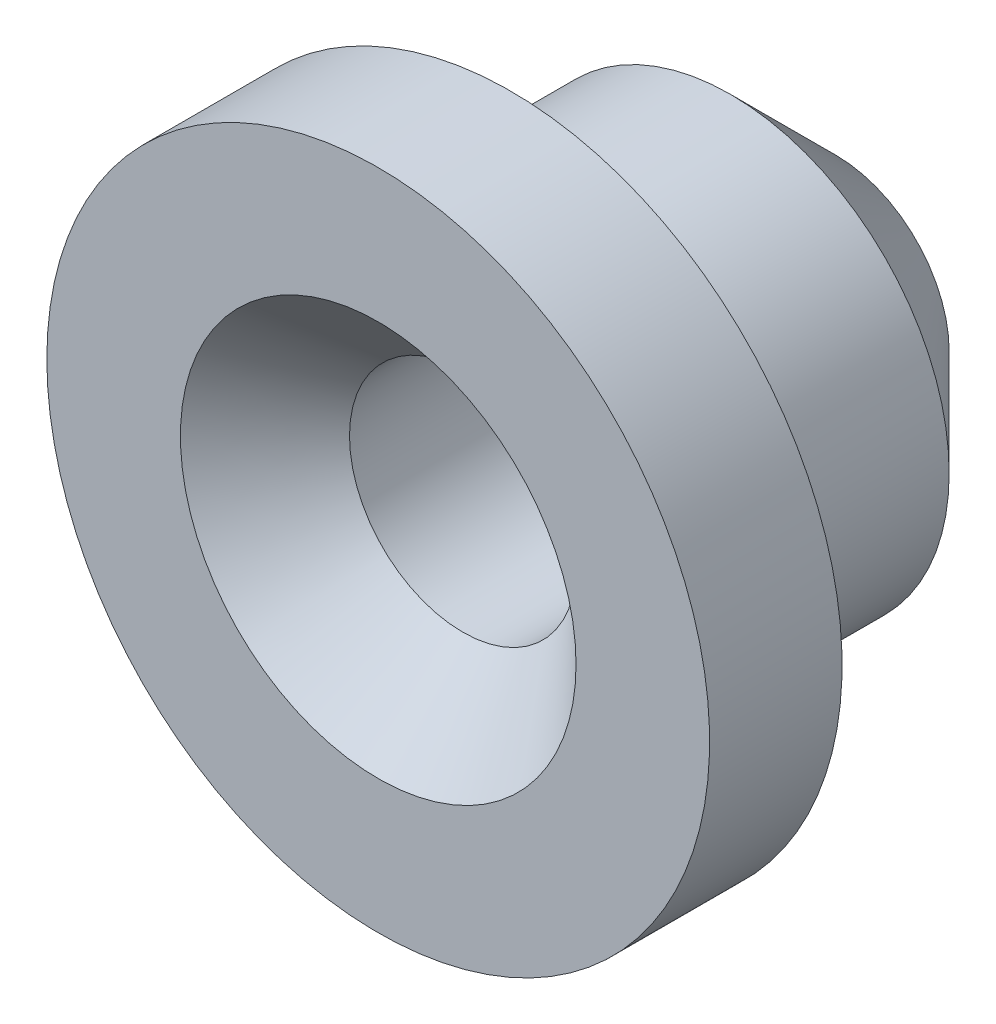
ISO-10303-21;
HEADER;
FILE_DESCRIPTION(('STEP AP214'),'2;1');
FILE_NAME('part.step','',(''),(''),'','','');
FILE_SCHEMA(('AUTOMOTIVE_DESIGN { 1 0 10303 214 1 1 1 1 }'));
ENDSEC;
DATA;
#1=APPLICATION_CONTEXT('core data for automotive mechanical design processes');
#2=APPLICATION_PROTOCOL_DEFINITION('international standard','automotive_design',2000,#1);
#3=PRODUCT_CONTEXT('',#1,'mechanical');
#4=PRODUCT('Part','Part','',(#3));
#5=PRODUCT_RELATED_PRODUCT_CATEGORY('part','',(#4));
#6=PRODUCT_DEFINITION_FORMATION('','',#4);
#7=PRODUCT_DEFINITION_CONTEXT('part definition',#1,'design');
#8=PRODUCT_DEFINITION('design','',#6,#7);
#9=PRODUCT_DEFINITION_SHAPE('','',#8);
#10=(LENGTH_UNIT() NAMED_UNIT(*) SI_UNIT(.MILLI.,.METRE.));
#11=(NAMED_UNIT(*) PLANE_ANGLE_UNIT() SI_UNIT($,.RADIAN.));
#12=(NAMED_UNIT(*) SI_UNIT($,.STERADIAN.) SOLID_ANGLE_UNIT());
#13=UNCERTAINTY_MEASURE_WITH_UNIT(LENGTH_MEASURE(1.E-05),#10,'distance_accuracy_value','');
#14=(GEOMETRIC_REPRESENTATION_CONTEXT(3) GLOBAL_UNCERTAINTY_ASSIGNED_CONTEXT((#13)) GLOBAL_UNIT_ASSIGNED_CONTEXT((#10,
#11,#12)) REPRESENTATION_CONTEXT('',''));
#15=CARTESIAN_POINT('',(0.,0.,0.));
#16=DIRECTION('',(0.,0.,1.));
#17=DIRECTION('',(1.,0.,0.));
#18=AXIS2_PLACEMENT_3D('',#15,#16,#17);
#19=CARTESIAN_POINT('',(-11.1939900407841,3.08591076799993,7.9375));
#20=DIRECTION('',(0.,0.,-1.));
#21=DIRECTION('',(-1.,0.,0.));
#22=AXIS2_PLACEMENT_3D('',#19,#20,#21);
#23=CYLINDRICAL_SURFACE('',#22,4.9276);
#24=CARTESIAN_POINT('',(-11.1939900407841,3.08591076799993,4.953));
#25=DIRECTION('',(0.,0.,-1.));
#26=DIRECTION('',(-1.,0.,0.));
#27=AXIS2_PLACEMENT_3D('',#24,#25,#26);
#28=CIRCLE('',#27,4.9276);
#29=CARTESIAN_POINT('',(-16.1215900407841,3.08591076799993,4.953));
#30=VERTEX_POINT('',#29);
#31=EDGE_CURVE('E52',#30,#30,#28,.T.);
#32=ORIENTED_EDGE('',*,*,#31,.T.);
#33=EDGE_LOOP('',(#32));
#34=FACE_BOUND('',#33,.T.);
#35=CARTESIAN_POINT('',(-11.1939900407841,3.08591076799993,0.));
#36=DIRECTION('',(0.,0.,-1.));
#37=DIRECTION('',(-1.,0.,0.));
#38=AXIS2_PLACEMENT_3D('',#35,#36,#37);
#39=CIRCLE('',#38,4.9276);
#40=CARTESIAN_POINT('',(-16.1215900407841,3.08591076799993,0.));
#41=VERTEX_POINT('',#40);
#42=EDGE_CURVE('E10',#41,#41,#39,.T.);
#43=ORIENTED_EDGE('',*,*,#42,.F.);
#44=EDGE_LOOP('',(#43));
#45=FACE_BOUND('',#44,.T.);
#46=ADVANCED_FACE('F35',(#34,#45),#23,.T.);
#47=CARTESIAN_POINT('',(-11.1939900407841,3.08591076799993,7.9375));
#48=DIRECTION('',(0.,0.,1.));
#49=DIRECTION('',(1.,0.,0.));
#50=AXIS2_PLACEMENT_3D('',#47,#48,#49);
#51=PLANE('',#50);
#52=CARTESIAN_POINT('',(-11.1939900407841,3.08591076799993,7.9375));
#53=DIRECTION('',(0.,0.,1.));
#54=DIRECTION('',(1.,0.,0.));
#55=AXIS2_PLACEMENT_3D('',#52,#53,#54);
#56=CIRCLE('',#55,4.4577);
#57=CARTESIAN_POINT('',(-6.73629004078405,3.08591076799993,7.9375));
#58=VERTEX_POINT('',#57);
#59=EDGE_CURVE('E49',#58,#58,#56,.T.);
#60=ORIENTED_EDGE('',*,*,#59,.F.);
#61=EDGE_LOOP('',(#60));
#62=FACE_BOUND('',#61,.T.);
#63=CARTESIAN_POINT('',(-11.1939900407841,3.08591076799993,7.9375));
#64=DIRECTION('',(0.,0.,-1.));
#65=DIRECTION('',(-1.,0.,0.));
#66=AXIS2_PLACEMENT_3D('',#63,#64,#65);
#67=CIRCLE('',#66,7.4676);
#68=CARTESIAN_POINT('',(-18.6615900407841,3.08591076799993,7.9375));
#69=VERTEX_POINT('',#68);
#70=EDGE_CURVE('E58',#69,#69,#67,.T.);
#71=ORIENTED_EDGE('',*,*,#70,.F.);
#72=EDGE_LOOP('',(#71));
#73=FACE_BOUND('',#72,.T.);
#74=ADVANCED_FACE('F65',(#62,#73),#51,.T.);
#75=CARTESIAN_POINT('',(-11.1939900407841,3.08591076799993,0.));
#76=DIRECTION('',(0.,0.,1.));
#77=DIRECTION('',(-1.,0.,0.));
#78=AXIS2_PLACEMENT_3D('',#75,#76,#77);
#79=CONICAL_SURFACE('',#78,4.9276,0.78539816339745);
#80=CARTESIAN_POINT('',(-11.1939900407841,3.08591076799993,-2.3749));
#81=DIRECTION('',(0.,0.,1.));
#82=DIRECTION('',(1.,0.,0.));
#83=AXIS2_PLACEMENT_3D('',#80,#81,#82);
#84=CIRCLE('',#83,2.55269999999999);
#85=CARTESIAN_POINT('',(-8.64129004078406,3.08591076799993,-2.3749));
#86=VERTEX_POINT('',#85);
#87=EDGE_CURVE('E38',#86,#86,#84,.T.);
#88=ORIENTED_EDGE('',*,*,#87,.T.);
#89=EDGE_LOOP('',(#88));
#90=FACE_BOUND('',#89,.T.);
#91=ORIENTED_EDGE('',*,*,#42,.T.);
#92=EDGE_LOOP('',(#91));
#93=FACE_BOUND('',#92,.T.);
#94=ADVANCED_FACE('F67',(#90,#93),#79,.T.);
#95=CARTESIAN_POINT('',(-11.1939900407841,3.08591076799993,7.9375));
#96=DIRECTION('',(0.,0.,1.));
#97=DIRECTION('',(1.,0.,0.));
#98=AXIS2_PLACEMENT_3D('',#95,#96,#97);
#99=CYLINDRICAL_SURFACE('',#98,2.55269999999999);
#100=CARTESIAN_POINT('',(-11.1939900407841,3.08591076799993,6.0325));
#101=DIRECTION('',(0.,0.,1.));
#102=DIRECTION('',(1.,0.,0.));
#103=AXIS2_PLACEMENT_3D('',#100,#101,#102);
#104=CIRCLE('',#103,2.5527);
#105=CARTESIAN_POINT('',(-8.64129004078406,3.08591076799993,6.0325));
#106=VERTEX_POINT('',#105);
#107=EDGE_CURVE('E45',#106,#106,#104,.T.);
#108=ORIENTED_EDGE('',*,*,#107,.T.);
#109=EDGE_LOOP('',(#108));
#110=FACE_BOUND('',#109,.T.);
#111=ORIENTED_EDGE('',*,*,#87,.F.);
#112=EDGE_LOOP('',(#111));
#113=FACE_BOUND('',#112,.T.);
#114=ADVANCED_FACE('F74',(#110,#113),#99,.F.);
#115=CARTESIAN_POINT('',(-11.1939900407841,3.08591076799993,7.9375));
#116=DIRECTION('',(0.,0.,1.));
#117=DIRECTION('',(1.,0.,0.));
#118=AXIS2_PLACEMENT_3D('',#115,#116,#117);
#119=CONICAL_SURFACE('',#118,4.4577,0.785398163397449);
#120=ORIENTED_EDGE('',*,*,#107,.F.);
#121=EDGE_LOOP('',(#120));
#122=FACE_BOUND('',#121,.T.);
#123=ORIENTED_EDGE('',*,*,#59,.T.);
#124=EDGE_LOOP('',(#123));
#125=FACE_BOUND('',#124,.T.);
#126=ADVANCED_FACE('F83',(#122,#125),#119,.F.);
#127=CARTESIAN_POINT('',(-16.1215900407841,3.08591076799993,4.953));
#128=DIRECTION('',(0.,0.,-1.));
#129=DIRECTION('',(-1.,0.,0.));
#130=AXIS2_PLACEMENT_3D('',#127,#128,#129);
#131=PLANE('',#130);
#132=CARTESIAN_POINT('',(-11.1939900407841,3.08591076799993,4.953));
#133=DIRECTION('',(0.,0.,-1.));
#134=DIRECTION('',(-1.,0.,0.));
#135=AXIS2_PLACEMENT_3D('',#132,#133,#134);
#136=CIRCLE('',#135,7.4676);
#137=CARTESIAN_POINT('',(-18.6615900407841,3.08591076799993,4.953));
#138=VERTEX_POINT('',#137);
#139=EDGE_CURVE('E55',#138,#138,#136,.T.);
#140=ORIENTED_EDGE('',*,*,#139,.T.);
#141=EDGE_LOOP('',(#140));
#142=FACE_BOUND('',#141,.T.);
#143=ORIENTED_EDGE('',*,*,#31,.F.);
#144=EDGE_LOOP('',(#143));
#145=FACE_BOUND('',#144,.T.);
#146=ADVANCED_FACE('F86',(#142,#145),#131,.T.);
#147=CARTESIAN_POINT('',(-11.1939900407841,3.08591076799993,-2.3749));
#148=DIRECTION('',(0.,0.,-1.));
#149=DIRECTION('',(-1.,0.,0.));
#150=AXIS2_PLACEMENT_3D('',#147,#148,#149);
#151=CYLINDRICAL_SURFACE('',#150,7.4676);
#152=ORIENTED_EDGE('',*,*,#70,.T.);
#153=EDGE_LOOP('',(#152));
#154=FACE_BOUND('',#153,.T.);
#155=ORIENTED_EDGE('',*,*,#139,.F.);
#156=EDGE_LOOP('',(#155));
#157=FACE_BOUND('',#156,.T.);
#158=ADVANCED_FACE('F62',(#154,#157),#151,.T.);
#159=CLOSED_SHELL('',(#46,#74,#94,#114,#126,#146,#158));
#160=MANIFOLD_SOLID_BREP('B2',#159);
#161=ADVANCED_BREP_SHAPE_REPRESENTATION('',(#18,#160),#14);
#162=SHAPE_DEFINITION_REPRESENTATION(#9,#161);
ENDSEC;
END-ISO-10303-21;
